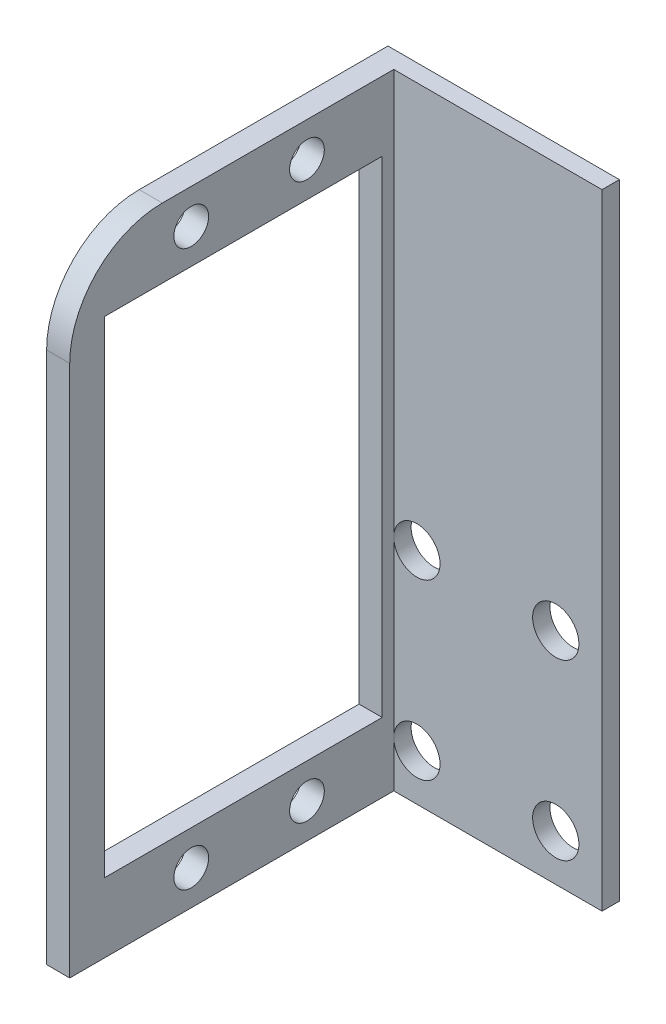
ISO-10303-21;
HEADER;
FILE_DESCRIPTION(('STEP AP214'),'2;1');
FILE_NAME('part.step','',(''),(''),'','','');
FILE_SCHEMA(('AUTOMOTIVE_DESIGN { 1 0 10303 214 1 1 1 1 }'));
ENDSEC;
DATA;
#1=APPLICATION_CONTEXT('core data for automotive mechanical design processes');
#2=APPLICATION_PROTOCOL_DEFINITION('international standard','automotive_design',2000,#1);
#3=PRODUCT_CONTEXT('',#1,'mechanical');
#4=PRODUCT('Part','Part','',(#3));
#5=PRODUCT_RELATED_PRODUCT_CATEGORY('part','',(#4));
#6=PRODUCT_DEFINITION_FORMATION('','',#4);
#7=PRODUCT_DEFINITION_CONTEXT('part definition',#1,'design');
#8=PRODUCT_DEFINITION('design','',#6,#7);
#9=PRODUCT_DEFINITION_SHAPE('','',#8);
#10=(LENGTH_UNIT() NAMED_UNIT(*) SI_UNIT(.MILLI.,.METRE.));
#11=(NAMED_UNIT(*) PLANE_ANGLE_UNIT() SI_UNIT($,.RADIAN.));
#12=(NAMED_UNIT(*) SI_UNIT($,.STERADIAN.) SOLID_ANGLE_UNIT());
#13=UNCERTAINTY_MEASURE_WITH_UNIT(LENGTH_MEASURE(1.E-05),#10,'distance_accuracy_value','');
#14=(GEOMETRIC_REPRESENTATION_CONTEXT(3) GLOBAL_UNCERTAINTY_ASSIGNED_CONTEXT((#13)) GLOBAL_UNIT_ASSIGNED_CONTEXT((#10,
#11,#12)) REPRESENTATION_CONTEXT('',''));
#15=CARTESIAN_POINT('',(0.,0.,0.));
#16=DIRECTION('',(0.,0.,1.));
#17=DIRECTION('',(1.,0.,0.));
#18=AXIS2_PLACEMENT_3D('',#15,#16,#17);
#19=CARTESIAN_POINT('',(2.,0.,0.));
#20=DIRECTION('',(1.,0.,0.));
#21=DIRECTION('',(0.,0.,-1.));
#22=AXIS2_PLACEMENT_3D('',#19,#20,#21);
#23=PLANE('',#22);
#24=CARTESIAN_POINT('',(2.,3.00000000000001,7.50000000000001));
#25=DIRECTION('',(1.,0.,0.));
#26=DIRECTION('',(0.,0.,1.));
#27=AXIS2_PLACEMENT_3D('',#24,#25,#26);
#28=CIRCLE('',#27,1.5);
#29=CARTESIAN_POINT('',(2.,3.00000000000001,9.00000000000001));
#30=VERTEX_POINT('',#29);
#31=EDGE_CURVE('E171',#30,#30,#28,.T.);
#32=ORIENTED_EDGE('',*,*,#31,.F.);
#33=EDGE_LOOP('',(#32));
#34=FACE_BOUND('',#33,.T.);
#35=CARTESIAN_POINT('',(2.,51.,7.50000000000001));
#36=DIRECTION('',(1.,0.,0.));
#37=DIRECTION('',(0.,0.,-1.));
#38=AXIS2_PLACEMENT_3D('',#35,#36,#37);
#39=CIRCLE('',#38,1.5);
#40=CARTESIAN_POINT('',(2.,51.,6.));
#41=VERTEX_POINT('',#40);
#42=EDGE_CURVE('E183',#41,#41,#39,.T.);
#43=ORIENTED_EDGE('',*,*,#42,.F.);
#44=EDGE_LOOP('',(#43));
#45=FACE_BOUND('',#44,.T.);
#46=DIRECTION('',(0.,0.,1.));
#47=VECTOR('',#46,1.);
#48=CARTESIAN_POINT('',(2.,54.,0.));
#49=LINE('',#48,#47);
#50=CARTESIAN_POINT('',(2.,54.,0.));
#51=VERTEX_POINT('',#50);
#52=CARTESIAN_POINT('',(2.,54.,20.));
#53=VERTEX_POINT('',#52);
#54=EDGE_CURVE('E221',#51,#53,#49,.T.);
#55=ORIENTED_EDGE('',*,*,#54,.T.);
#56=CARTESIAN_POINT('',(2.,46.,20.));
#57=DIRECTION('',(1.,0.,0.));
#58=DIRECTION('',(0.,0.,-1.));
#59=AXIS2_PLACEMENT_3D('',#56,#57,#58);
#60=CIRCLE('',#59,8.);
#61=CARTESIAN_POINT('',(2.,46.,28.));
#62=VERTEX_POINT('',#61);
#63=EDGE_CURVE('E11',#53,#62,#60,.T.);
#64=ORIENTED_EDGE('',*,*,#63,.T.);
#65=DIRECTION('',(0.,-1.,0.));
#66=VECTOR('',#65,1.);
#67=CARTESIAN_POINT('',(2.,0.,28.));
#68=LINE('',#67,#66);
#69=CARTESIAN_POINT('',(2.,0.,28.));
#70=VERTEX_POINT('',#69);
#71=EDGE_CURVE('E225',#62,#70,#68,.T.);
#72=ORIENTED_EDGE('',*,*,#71,.T.);
#73=DIRECTION('',(0.,0.,-1.));
#74=VECTOR('',#73,1.);
#75=CARTESIAN_POINT('',(2.,0.,0.));
#76=LINE('',#75,#74);
#77=CARTESIAN_POINT('',(2.,0.,0.));
#78=VERTEX_POINT('',#77);
#79=EDGE_CURVE('E227',#70,#78,#76,.T.);
#80=ORIENTED_EDGE('',*,*,#79,.T.);
#81=DIRECTION('',(0.,1.,0.));
#82=VECTOR('',#81,1.);
#83=CARTESIAN_POINT('',(2.,0.,0.));
#84=LINE('',#83,#82);
#85=CARTESIAN_POINT('',(1.99999999999999,4.,0.));
#86=VERTEX_POINT('',#85);
#87=EDGE_CURVE('E218',#78,#86,#84,.T.);
#88=ORIENTED_EDGE('',*,*,#87,.T.);
#89=CARTESIAN_POINT('',(1.99999999999999,19.,0.));
#90=VERTEX_POINT('',#89);
#91=EDGE_CURVE('E222',#86,#90,#84,.T.);
#92=ORIENTED_EDGE('',*,*,#91,.T.);
#93=EDGE_CURVE('E223',#90,#51,#84,.T.);
#94=ORIENTED_EDGE('',*,*,#93,.T.);
#95=EDGE_LOOP('',(#55,#64,#72,#80,#88,#92,#94));
#96=FACE_BOUND('',#95,.T.);
#97=DIRECTION('',(0.,0.,-1.));
#98=VECTOR('',#97,1.);
#99=CARTESIAN_POINT('',(2.,6.,25.));
#100=LINE('',#99,#98);
#101=CARTESIAN_POINT('',(2.,6.,25.));
#102=VERTEX_POINT('',#101);
#103=CARTESIAN_POINT('',(2.,6.,0.99999999999999));
#104=VERTEX_POINT('',#103);
#105=EDGE_CURVE('E191',#102,#104,#100,.T.);
#106=ORIENTED_EDGE('',*,*,#105,.F.);
#107=DIRECTION('',(0.,-1.,0.));
#108=VECTOR('',#107,1.);
#109=CARTESIAN_POINT('',(2.,48.,25.));
#110=LINE('',#109,#108);
#111=CARTESIAN_POINT('',(2.,48.,25.));
#112=VERTEX_POINT('',#111);
#113=EDGE_CURVE('E189',#112,#102,#110,.T.);
#114=ORIENTED_EDGE('',*,*,#113,.F.);
#115=DIRECTION('',(0.,0.,1.));
#116=VECTOR('',#115,1.);
#117=CARTESIAN_POINT('',(2.,48.,25.));
#118=LINE('',#117,#116);
#119=CARTESIAN_POINT('',(2.,48.,0.999999999999993));
#120=VERTEX_POINT('',#119);
#121=EDGE_CURVE('E197',#120,#112,#118,.T.);
#122=ORIENTED_EDGE('',*,*,#121,.F.);
#123=DIRECTION('',(0.,1.,0.));
#124=VECTOR('',#123,1.);
#125=CARTESIAN_POINT('',(2.,48.,0.999999999999993));
#126=LINE('',#125,#124);
#127=EDGE_CURVE('E194',#104,#120,#126,.T.);
#128=ORIENTED_EDGE('',*,*,#127,.F.);
#129=EDGE_LOOP('',(#106,#114,#122,#128));
#130=FACE_BOUND('',#129,.T.);
#131=CARTESIAN_POINT('',(2.,51.,17.5));
#132=DIRECTION('',(1.,0.,0.));
#133=DIRECTION('',(0.,0.,-1.));
#134=AXIS2_PLACEMENT_3D('',#131,#132,#133);
#135=CIRCLE('',#134,1.5);
#136=CARTESIAN_POINT('',(2.,51.,16.));
#137=VERTEX_POINT('',#136);
#138=EDGE_CURVE('E177',#137,#137,#135,.T.);
#139=ORIENTED_EDGE('',*,*,#138,.F.);
#140=EDGE_LOOP('',(#139));
#141=FACE_BOUND('',#140,.T.);
#142=CARTESIAN_POINT('',(2.,3.,17.5));
#143=DIRECTION('',(1.,0.,0.));
#144=DIRECTION('',(0.,0.,1.));
#145=AXIS2_PLACEMENT_3D('',#142,#143,#144);
#146=CIRCLE('',#145,1.49999999999999);
#147=CARTESIAN_POINT('',(2.,3.,19.));
#148=VERTEX_POINT('',#147);
#149=EDGE_CURVE('E165',#148,#148,#146,.T.);
#150=ORIENTED_EDGE('',*,*,#149,.F.);
#151=EDGE_LOOP('',(#150));
#152=FACE_BOUND('',#151,.T.);
#153=ADVANCED_FACE('F35',(#34,#45,#96,#130,#141,#152),#23,.T.);
#154=CARTESIAN_POINT('',(0.,0.,0.));
#155=DIRECTION('',(1.,0.,0.));
#156=DIRECTION('',(0.,0.,-1.));
#157=AXIS2_PLACEMENT_3D('',#154,#155,#156);
#158=PLANE('',#157);
#159=DIRECTION('',(0.,-1.,0.));
#160=VECTOR('',#159,1.);
#161=CARTESIAN_POINT('',(0.,0.,28.));
#162=LINE('',#161,#160);
#163=CARTESIAN_POINT('',(0.,46.,28.));
#164=VERTEX_POINT('',#163);
#165=CARTESIAN_POINT('',(0.,0.,28.));
#166=VERTEX_POINT('',#165);
#167=EDGE_CURVE('E128',#164,#166,#162,.T.);
#168=ORIENTED_EDGE('',*,*,#167,.F.);
#169=CARTESIAN_POINT('',(0.,46.,20.));
#170=DIRECTION('',(1.,0.,0.));
#171=DIRECTION('',(0.,0.,-1.));
#172=AXIS2_PLACEMENT_3D('',#169,#170,#171);
#173=CIRCLE('',#172,8.);
#174=CARTESIAN_POINT('',(0.,54.,20.));
#175=VERTEX_POINT('',#174);
#176=EDGE_CURVE('E57',#164,#175,#173,.F.);
#177=ORIENTED_EDGE('',*,*,#176,.T.);
#178=DIRECTION('',(0.,0.,1.));
#179=VECTOR('',#178,1.);
#180=CARTESIAN_POINT('',(0.,54.,0.));
#181=LINE('',#180,#179);
#182=CARTESIAN_POINT('',(0.,54.,-1.5));
#183=VERTEX_POINT('',#182);
#184=EDGE_CURVE('E121',#183,#175,#181,.T.);
#185=ORIENTED_EDGE('',*,*,#184,.F.);
#186=DIRECTION('',(0.,1.,0.));
#187=VECTOR('',#186,1.);
#188=CARTESIAN_POINT('',(0.,54.,-1.5));
#189=LINE('',#188,#187);
#190=CARTESIAN_POINT('',(0.,0.,-1.5));
#191=VERTEX_POINT('',#190);
#192=EDGE_CURVE('E127',#191,#183,#189,.T.);
#193=ORIENTED_EDGE('',*,*,#192,.F.);
#194=DIRECTION('',(0.,0.,-1.));
#195=VECTOR('',#194,1.);
#196=CARTESIAN_POINT('',(0.,0.,0.));
#197=LINE('',#196,#195);
#198=EDGE_CURVE('E232',#166,#191,#197,.T.);
#199=ORIENTED_EDGE('',*,*,#198,.F.);
#200=EDGE_LOOP('',(#168,#177,#185,#193,#199));
#201=FACE_BOUND('',#200,.T.);
#202=DIRECTION('',(0.,-1.,0.));
#203=VECTOR('',#202,1.);
#204=CARTESIAN_POINT('',(0.,48.,25.));
#205=LINE('',#204,#203);
#206=CARTESIAN_POINT('',(0.,48.,25.));
#207=VERTEX_POINT('',#206);
#208=CARTESIAN_POINT('',(0.,6.,25.));
#209=VERTEX_POINT('',#208);
#210=EDGE_CURVE('E186',#207,#209,#205,.T.);
#211=ORIENTED_EDGE('',*,*,#210,.T.);
#212=DIRECTION('',(0.,0.,-1.));
#213=VECTOR('',#212,1.);
#214=CARTESIAN_POINT('',(0.,6.,25.));
#215=LINE('',#214,#213);
#216=CARTESIAN_POINT('',(0.,6.,0.99999999999999));
#217=VERTEX_POINT('',#216);
#218=EDGE_CURVE('E202',#209,#217,#215,.T.);
#219=ORIENTED_EDGE('',*,*,#218,.T.);
#220=DIRECTION('',(0.,1.,0.));
#221=VECTOR('',#220,1.);
#222=CARTESIAN_POINT('',(0.,48.,0.999999999999993));
#223=LINE('',#222,#221);
#224=CARTESIAN_POINT('',(0.,48.,0.999999999999993));
#225=VERTEX_POINT('',#224);
#226=EDGE_CURVE('E205',#217,#225,#223,.T.);
#227=ORIENTED_EDGE('',*,*,#226,.T.);
#228=DIRECTION('',(0.,0.,1.));
#229=VECTOR('',#228,1.);
#230=CARTESIAN_POINT('',(0.,48.,25.));
#231=LINE('',#230,#229);
#232=EDGE_CURVE('E192',#225,#207,#231,.T.);
#233=ORIENTED_EDGE('',*,*,#232,.T.);
#234=EDGE_LOOP('',(#211,#219,#227,#233));
#235=FACE_BOUND('',#234,.T.);
#236=CARTESIAN_POINT('',(0.,51.,7.50000000000001));
#237=DIRECTION('',(1.,0.,0.));
#238=DIRECTION('',(0.,0.,-1.));
#239=AXIS2_PLACEMENT_3D('',#236,#237,#238);
#240=CIRCLE('',#239,1.5);
#241=CARTESIAN_POINT('',(0.,51.,6.));
#242=VERTEX_POINT('',#241);
#243=EDGE_CURVE('E180',#242,#242,#240,.T.);
#244=ORIENTED_EDGE('',*,*,#243,.T.);
#245=EDGE_LOOP('',(#244));
#246=FACE_BOUND('',#245,.T.);
#247=CARTESIAN_POINT('',(0.,51.,17.5));
#248=DIRECTION('',(1.,0.,0.));
#249=DIRECTION('',(0.,0.,-1.));
#250=AXIS2_PLACEMENT_3D('',#247,#248,#249);
#251=CIRCLE('',#250,1.5);
#252=CARTESIAN_POINT('',(0.,51.,16.));
#253=VERTEX_POINT('',#252);
#254=EDGE_CURVE('E174',#253,#253,#251,.T.);
#255=ORIENTED_EDGE('',*,*,#254,.T.);
#256=EDGE_LOOP('',(#255));
#257=FACE_BOUND('',#256,.T.);
#258=CARTESIAN_POINT('',(0.,3.00000000000001,7.50000000000001));
#259=DIRECTION('',(1.,0.,0.));
#260=DIRECTION('',(0.,0.,1.));
#261=AXIS2_PLACEMENT_3D('',#258,#259,#260);
#262=CIRCLE('',#261,1.5);
#263=CARTESIAN_POINT('',(0.,3.00000000000001,9.00000000000001));
#264=VERTEX_POINT('',#263);
#265=EDGE_CURVE('E168',#264,#264,#262,.T.);
#266=ORIENTED_EDGE('',*,*,#265,.T.);
#267=EDGE_LOOP('',(#266));
#268=FACE_BOUND('',#267,.T.);
#269=CARTESIAN_POINT('',(0.,3.,17.5));
#270=DIRECTION('',(1.,0.,0.));
#271=DIRECTION('',(0.,0.,1.));
#272=AXIS2_PLACEMENT_3D('',#269,#270,#271);
#273=CIRCLE('',#272,1.49999999999999);
#274=CARTESIAN_POINT('',(0.,3.,19.));
#275=VERTEX_POINT('',#274);
#276=EDGE_CURVE('E164',#275,#275,#273,.T.);
#277=ORIENTED_EDGE('',*,*,#276,.T.);
#278=EDGE_LOOP('',(#277));
#279=FACE_BOUND('',#278,.T.);
#280=ADVANCED_FACE('F123',(#201,#235,#246,#257,#268,#279),#158,.F.);
#281=CARTESIAN_POINT('',(2.,54.,0.));
#282=DIRECTION('',(0.,-1.,0.));
#283=DIRECTION('',(0.,0.,-1.));
#284=AXIS2_PLACEMENT_3D('',#281,#282,#283);
#285=PLANE('',#284);
#286=ORIENTED_EDGE('',*,*,#184,.T.);
#287=DIRECTION('',(-1.,0.,0.));
#288=VECTOR('',#287,1.);
#289=CARTESIAN_POINT('',(2.,54.,20.));
#290=LINE('',#289,#288);
#291=EDGE_CURVE('E43',#175,#53,#290,.F.);
#292=ORIENTED_EDGE('',*,*,#291,.T.);
#293=ORIENTED_EDGE('',*,*,#54,.F.);
#294=DIRECTION('',(1.,0.,0.));
#295=VECTOR('',#294,1.);
#296=CARTESIAN_POINT('',(0.,54.,0.));
#297=LINE('',#296,#295);
#298=CARTESIAN_POINT('',(20.,54.,0.));
#299=VERTEX_POINT('',#298);
#300=EDGE_CURVE('E157',#51,#299,#297,.T.);
#301=ORIENTED_EDGE('',*,*,#300,.T.);
#302=DIRECTION('',(0.,0.,1.));
#303=VECTOR('',#302,1.);
#304=CARTESIAN_POINT('',(20.,54.,-1.5));
#305=LINE('',#304,#303);
#306=CARTESIAN_POINT('',(20.,54.,-1.5));
#307=VERTEX_POINT('',#306);
#308=EDGE_CURVE('E135',#307,#299,#305,.T.);
#309=ORIENTED_EDGE('',*,*,#308,.F.);
#310=DIRECTION('',(1.,0.,0.));
#311=VECTOR('',#310,1.);
#312=CARTESIAN_POINT('',(0.,54.,-1.5));
#313=LINE('',#312,#311);
#314=EDGE_CURVE('E132',#183,#307,#313,.T.);
#315=ORIENTED_EDGE('',*,*,#314,.F.);
#316=EDGE_LOOP('',(#286,#292,#293,#301,#309,#315));
#317=FACE_BOUND('',#316,.T.);
#318=ADVANCED_FACE('F133',(#317),#285,.F.);
#319=CARTESIAN_POINT('',(2.,0.,28.));
#320=DIRECTION('',(0.,0.,-1.));
#321=DIRECTION('',(-1.,0.,0.));
#322=AXIS2_PLACEMENT_3D('',#319,#320,#321);
#323=PLANE('',#322);
#324=ORIENTED_EDGE('',*,*,#71,.F.);
#325=DIRECTION('',(-1.,0.,0.));
#326=VECTOR('',#325,1.);
#327=CARTESIAN_POINT('',(2.,46.,28.));
#328=LINE('',#327,#326);
#329=EDGE_CURVE('E236',#62,#164,#328,.T.);
#330=ORIENTED_EDGE('',*,*,#329,.T.);
#331=ORIENTED_EDGE('',*,*,#167,.T.);
#332=DIRECTION('',(-1.,0.,0.));
#333=VECTOR('',#332,1.);
#334=CARTESIAN_POINT('',(2.,0.,28.));
#335=LINE('',#334,#333);
#336=EDGE_CURVE('E229',#70,#166,#335,.T.);
#337=ORIENTED_EDGE('',*,*,#336,.F.);
#338=EDGE_LOOP('',(#324,#330,#331,#337));
#339=FACE_BOUND('',#338,.T.);
#340=ADVANCED_FACE('F242',(#339),#323,.F.);
#341=CARTESIAN_POINT('',(2.,0.,0.));
#342=DIRECTION('',(0.,1.,0.));
#343=DIRECTION('',(0.,0.,1.));
#344=AXIS2_PLACEMENT_3D('',#341,#342,#343);
#345=PLANE('',#344);
#346=ORIENTED_EDGE('',*,*,#198,.T.);
#347=DIRECTION('',(-1.,0.,0.));
#348=VECTOR('',#347,1.);
#349=CARTESIAN_POINT('',(0.,0.,-1.5));
#350=LINE('',#349,#348);
#351=CARTESIAN_POINT('',(20.,0.,-1.5));
#352=VERTEX_POINT('',#351);
#353=EDGE_CURVE('E144',#352,#191,#350,.T.);
#354=ORIENTED_EDGE('',*,*,#353,.F.);
#355=DIRECTION('',(0.,0.,1.));
#356=VECTOR('',#355,1.);
#357=CARTESIAN_POINT('',(20.,0.,-1.5));
#358=LINE('',#357,#356);
#359=CARTESIAN_POINT('',(20.,0.,0.));
#360=VERTEX_POINT('',#359);
#361=EDGE_CURVE('E156',#352,#360,#358,.T.);
#362=ORIENTED_EDGE('',*,*,#361,.T.);
#363=DIRECTION('',(-1.,0.,0.));
#364=VECTOR('',#363,1.);
#365=CARTESIAN_POINT('',(0.,0.,0.));
#366=LINE('',#365,#364);
#367=EDGE_CURVE('E145',#360,#78,#366,.T.);
#368=ORIENTED_EDGE('',*,*,#367,.T.);
#369=ORIENTED_EDGE('',*,*,#79,.F.);
#370=ORIENTED_EDGE('',*,*,#336,.T.);
#371=EDGE_LOOP('',(#346,#354,#362,#368,#369,#370));
#372=FACE_BOUND('',#371,.T.);
#373=ADVANCED_FACE('F247',(#372),#345,.F.);
#374=CARTESIAN_POINT('',(2.,48.,25.));
#375=DIRECTION('',(0.,0.,-1.));
#376=DIRECTION('',(0.,1.,0.));
#377=AXIS2_PLACEMENT_3D('',#374,#375,#376);
#378=PLANE('',#377);
#379=ORIENTED_EDGE('',*,*,#210,.F.);
#380=DIRECTION('',(-1.,0.,0.));
#381=VECTOR('',#380,1.);
#382=CARTESIAN_POINT('',(2.,48.,25.));
#383=LINE('',#382,#381);
#384=EDGE_CURVE('E199',#112,#207,#383,.T.);
#385=ORIENTED_EDGE('',*,*,#384,.F.);
#386=ORIENTED_EDGE('',*,*,#113,.T.);
#387=DIRECTION('',(-1.,0.,0.));
#388=VECTOR('',#387,1.);
#389=CARTESIAN_POINT('',(2.,6.,25.));
#390=LINE('',#389,#388);
#391=EDGE_CURVE('E129',#102,#209,#390,.T.);
#392=ORIENTED_EDGE('',*,*,#391,.T.);
#393=EDGE_LOOP('',(#379,#385,#386,#392));
#394=FACE_BOUND('',#393,.T.);
#395=ADVANCED_FACE('F273',(#394),#378,.T.);
#396=CARTESIAN_POINT('',(2.,6.,25.));
#397=DIRECTION('',(0.,1.,0.));
#398=DIRECTION('',(0.,0.,1.));
#399=AXIS2_PLACEMENT_3D('',#396,#397,#398);
#400=PLANE('',#399);
#401=ORIENTED_EDGE('',*,*,#218,.F.);
#402=ORIENTED_EDGE('',*,*,#391,.F.);
#403=ORIENTED_EDGE('',*,*,#105,.T.);
#404=DIRECTION('',(-1.,0.,0.));
#405=VECTOR('',#404,1.);
#406=CARTESIAN_POINT('',(2.,6.,0.99999999999999));
#407=LINE('',#406,#405);
#408=EDGE_CURVE('E214',#104,#217,#407,.T.);
#409=ORIENTED_EDGE('',*,*,#408,.T.);
#410=EDGE_LOOP('',(#401,#402,#403,#409));
#411=FACE_BOUND('',#410,.T.);
#412=ADVANCED_FACE('F423',(#411),#400,.T.);
#413=CARTESIAN_POINT('',(2.,48.,0.999999999999993));
#414=DIRECTION('',(0.,0.,1.));
#415=DIRECTION('',(0.,-1.,0.));
#416=AXIS2_PLACEMENT_3D('',#413,#414,#415);
#417=PLANE('',#416);
#418=ORIENTED_EDGE('',*,*,#226,.F.);
#419=ORIENTED_EDGE('',*,*,#408,.F.);
#420=ORIENTED_EDGE('',*,*,#127,.T.);
#421=DIRECTION('',(-1.,0.,0.));
#422=VECTOR('',#421,1.);
#423=CARTESIAN_POINT('',(2.,48.,0.999999999999993));
#424=LINE('',#423,#422);
#425=EDGE_CURVE('E212',#120,#225,#424,.T.);
#426=ORIENTED_EDGE('',*,*,#425,.T.);
#427=EDGE_LOOP('',(#418,#419,#420,#426));
#428=FACE_BOUND('',#427,.T.);
#429=ADVANCED_FACE('F414',(#428),#417,.T.);
#430=CARTESIAN_POINT('',(2.,48.,25.));
#431=DIRECTION('',(0.,-1.,0.));
#432=DIRECTION('',(0.,0.,-1.));
#433=AXIS2_PLACEMENT_3D('',#430,#431,#432);
#434=PLANE('',#433);
#435=ORIENTED_EDGE('',*,*,#232,.F.);
#436=ORIENTED_EDGE('',*,*,#425,.F.);
#437=ORIENTED_EDGE('',*,*,#121,.T.);
#438=ORIENTED_EDGE('',*,*,#384,.T.);
#439=EDGE_LOOP('',(#435,#436,#437,#438));
#440=FACE_BOUND('',#439,.T.);
#441=ADVANCED_FACE('F405',(#440),#434,.T.);
#442=CARTESIAN_POINT('',(2.,51.,7.50000000000001));
#443=DIRECTION('',(-1.,0.,0.));
#444=DIRECTION('',(0.,0.,1.));
#445=AXIS2_PLACEMENT_3D('',#442,#443,#444);
#446=CYLINDRICAL_SURFACE('',#445,1.5);
#447=ORIENTED_EDGE('',*,*,#42,.T.);
#448=EDGE_LOOP('',(#447));
#449=FACE_BOUND('',#448,.T.);
#450=ORIENTED_EDGE('',*,*,#243,.F.);
#451=EDGE_LOOP('',(#450));
#452=FACE_BOUND('',#451,.T.);
#453=ADVANCED_FACE('F396',(#449,#452),#446,.F.);
#454=CARTESIAN_POINT('',(2.,51.,17.5));
#455=DIRECTION('',(-1.,0.,0.));
#456=DIRECTION('',(0.,0.,1.));
#457=AXIS2_PLACEMENT_3D('',#454,#455,#456);
#458=CYLINDRICAL_SURFACE('',#457,1.5);
#459=ORIENTED_EDGE('',*,*,#138,.T.);
#460=EDGE_LOOP('',(#459));
#461=FACE_BOUND('',#460,.T.);
#462=ORIENTED_EDGE('',*,*,#254,.F.);
#463=EDGE_LOOP('',(#462));
#464=FACE_BOUND('',#463,.T.);
#465=ADVANCED_FACE('F387',(#461,#464),#458,.F.);
#466=CARTESIAN_POINT('',(2.,3.00000000000001,7.50000000000001));
#467=DIRECTION('',(-1.,0.,0.));
#468=DIRECTION('',(0.,0.,1.));
#469=AXIS2_PLACEMENT_3D('',#466,#467,#468);
#470=CYLINDRICAL_SURFACE('',#469,1.5);
#471=ORIENTED_EDGE('',*,*,#31,.T.);
#472=EDGE_LOOP('',(#471));
#473=FACE_BOUND('',#472,.T.);
#474=ORIENTED_EDGE('',*,*,#265,.F.);
#475=EDGE_LOOP('',(#474));
#476=FACE_BOUND('',#475,.T.);
#477=ADVANCED_FACE('F378',(#473,#476),#470,.F.);
#478=CARTESIAN_POINT('',(2.,3.,17.5));
#479=DIRECTION('',(-1.,0.,0.));
#480=DIRECTION('',(0.,0.,1.));
#481=AXIS2_PLACEMENT_3D('',#478,#479,#480);
#482=CYLINDRICAL_SURFACE('',#481,1.49999999999999);
#483=ORIENTED_EDGE('',*,*,#149,.T.);
#484=EDGE_LOOP('',(#483));
#485=FACE_BOUND('',#484,.T.);
#486=ORIENTED_EDGE('',*,*,#276,.F.);
#487=EDGE_LOOP('',(#486));
#488=FACE_BOUND('',#487,.T.);
#489=ADVANCED_FACE('F347',(#485,#488),#482,.F.);
#490=CARTESIAN_POINT('',(0.,0.,0.));
#491=DIRECTION('',(0.,0.,1.));
#492=DIRECTION('',(0.,-1.,0.));
#493=AXIS2_PLACEMENT_3D('',#490,#491,#492);
#494=PLANE('',#493);
#495=CARTESIAN_POINT('',(16.,19.,0.));
#496=DIRECTION('',(0.,0.,-1.));
#497=DIRECTION('',(0.,-1.,0.));
#498=AXIS2_PLACEMENT_3D('',#495,#496,#497);
#499=CIRCLE('',#498,2.);
#500=CARTESIAN_POINT('',(16.,17.,0.));
#501=VERTEX_POINT('',#500);
#502=EDGE_CURVE('E489',#501,#501,#499,.T.);
#503=ORIENTED_EDGE('',*,*,#502,.T.);
#504=EDGE_LOOP('',(#503));
#505=FACE_BOUND('',#504,.T.);
#506=CARTESIAN_POINT('',(16.,4.,0.));
#507=DIRECTION('',(0.,0.,-1.));
#508=DIRECTION('',(0.,1.,0.));
#509=AXIS2_PLACEMENT_3D('',#506,#507,#508);
#510=CIRCLE('',#509,2.);
#511=CARTESIAN_POINT('',(16.,6.,0.));
#512=VERTEX_POINT('',#511);
#513=EDGE_CURVE('E151',#512,#512,#510,.T.);
#514=ORIENTED_EDGE('',*,*,#513,.T.);
#515=EDGE_LOOP('',(#514));
#516=FACE_BOUND('',#515,.T.);
#517=ORIENTED_EDGE('',*,*,#87,.F.);
#518=ORIENTED_EDGE('',*,*,#367,.F.);
#519=DIRECTION('',(0.,-1.,0.));
#520=VECTOR('',#519,1.);
#521=CARTESIAN_POINT('',(20.,54.,0.));
#522=LINE('',#521,#520);
#523=EDGE_CURVE('E148',#299,#360,#522,.T.);
#524=ORIENTED_EDGE('',*,*,#523,.F.);
#525=ORIENTED_EDGE('',*,*,#300,.F.);
#526=ORIENTED_EDGE('',*,*,#93,.F.);
#527=CARTESIAN_POINT('',(3.99999999999999,19.,0.));
#528=DIRECTION('',(0.,0.,-1.));
#529=DIRECTION('',(0.,-1.,0.));
#530=AXIS2_PLACEMENT_3D('',#527,#528,#529);
#531=CIRCLE('',#530,2.);
#532=EDGE_CURVE('E505',#90,#90,#531,.T.);
#533=ORIENTED_EDGE('',*,*,#532,.T.);
#534=ORIENTED_EDGE('',*,*,#91,.F.);
#535=CARTESIAN_POINT('',(3.99999999999999,4.,0.));
#536=DIRECTION('',(0.,0.,-1.));
#537=DIRECTION('',(0.,1.,0.));
#538=AXIS2_PLACEMENT_3D('',#535,#536,#537);
#539=CIRCLE('',#538,2.);
#540=EDGE_CURVE('E496',#86,#86,#539,.T.);
#541=ORIENTED_EDGE('',*,*,#540,.T.);
#542=EDGE_LOOP('',(#517,#518,#524,#525,#526,#533,#534,#541));
#543=FACE_BOUND('',#542,.T.);
#544=ADVANCED_FACE('F339',(#505,#516,#543),#494,.T.);
#545=CARTESIAN_POINT('',(0.,0.,-1.5));
#546=DIRECTION('',(0.,0.,1.));
#547=DIRECTION('',(0.,-1.,0.));
#548=AXIS2_PLACEMENT_3D('',#545,#546,#547);
#549=PLANE('',#548);
#550=ORIENTED_EDGE('',*,*,#192,.T.);
#551=ORIENTED_EDGE('',*,*,#314,.T.);
#552=DIRECTION('',(0.,-1.,0.));
#553=VECTOR('',#552,1.);
#554=CARTESIAN_POINT('',(20.,54.,-1.5));
#555=LINE('',#554,#553);
#556=EDGE_CURVE('E138',#307,#352,#555,.T.);
#557=ORIENTED_EDGE('',*,*,#556,.T.);
#558=ORIENTED_EDGE('',*,*,#353,.T.);
#559=EDGE_LOOP('',(#550,#551,#557,#558));
#560=FACE_BOUND('',#559,.T.);
#561=CARTESIAN_POINT('',(16.,4.,-1.5));
#562=DIRECTION('',(0.,0.,-1.));
#563=DIRECTION('',(0.,1.,0.));
#564=AXIS2_PLACEMENT_3D('',#561,#562,#563);
#565=CIRCLE('',#564,2.);
#566=CARTESIAN_POINT('',(16.,6.,-1.5));
#567=VERTEX_POINT('',#566);
#568=EDGE_CURVE('E159',#567,#567,#565,.T.);
#569=ORIENTED_EDGE('',*,*,#568,.F.);
#570=EDGE_LOOP('',(#569));
#571=FACE_BOUND('',#570,.T.);
#572=CARTESIAN_POINT('',(3.99999999999999,4.,-1.5));
#573=DIRECTION('',(0.,0.,-1.));
#574=DIRECTION('',(0.,1.,0.));
#575=AXIS2_PLACEMENT_3D('',#572,#573,#574);
#576=CIRCLE('',#575,2.);
#577=CARTESIAN_POINT('',(3.99999999999999,6.,-1.5));
#578=VERTEX_POINT('',#577);
#579=EDGE_CURVE('E499',#578,#578,#576,.T.);
#580=ORIENTED_EDGE('',*,*,#579,.F.);
#581=EDGE_LOOP('',(#580));
#582=FACE_BOUND('',#581,.T.);
#583=CARTESIAN_POINT('',(3.99999999999999,19.,-1.5));
#584=DIRECTION('',(0.,0.,-1.));
#585=DIRECTION('',(0.,-1.,0.));
#586=AXIS2_PLACEMENT_3D('',#583,#584,#585);
#587=CIRCLE('',#586,2.);
#588=CARTESIAN_POINT('',(3.99999999999999,17.,-1.5));
#589=VERTEX_POINT('',#588);
#590=EDGE_CURVE('E500',#589,#589,#587,.T.);
#591=ORIENTED_EDGE('',*,*,#590,.F.);
#592=EDGE_LOOP('',(#591));
#593=FACE_BOUND('',#592,.T.);
#594=CARTESIAN_POINT('',(16.,19.,-1.5));
#595=DIRECTION('',(0.,0.,-1.));
#596=DIRECTION('',(0.,-1.,0.));
#597=AXIS2_PLACEMENT_3D('',#594,#595,#596);
#598=CIRCLE('',#597,2.);
#599=CARTESIAN_POINT('',(16.,17.,-1.5));
#600=VERTEX_POINT('',#599);
#601=EDGE_CURVE('E518',#600,#600,#598,.T.);
#602=ORIENTED_EDGE('',*,*,#601,.F.);
#603=EDGE_LOOP('',(#602));
#604=FACE_BOUND('',#603,.T.);
#605=ADVANCED_FACE('F141',(#560,#571,#582,#593,#604),#549,.F.);
#606=CARTESIAN_POINT('',(20.,54.,-1.5));
#607=DIRECTION('',(-1.,0.,0.));
#608=DIRECTION('',(0.,-1.,0.));
#609=AXIS2_PLACEMENT_3D('',#606,#607,#608);
#610=PLANE('',#609);
#611=ORIENTED_EDGE('',*,*,#523,.T.);
#612=ORIENTED_EDGE('',*,*,#361,.F.);
#613=ORIENTED_EDGE('',*,*,#556,.F.);
#614=ORIENTED_EDGE('',*,*,#308,.T.);
#615=EDGE_LOOP('',(#611,#612,#613,#614));
#616=FACE_BOUND('',#615,.T.);
#617=ADVANCED_FACE('F322',(#616),#610,.F.);
#618=CARTESIAN_POINT('',(16.,4.,-1.5));
#619=DIRECTION('',(0.,0.,1.));
#620=DIRECTION('',(0.,-1.,0.));
#621=AXIS2_PLACEMENT_3D('',#618,#619,#620);
#622=CYLINDRICAL_SURFACE('',#621,2.);
#623=ORIENTED_EDGE('',*,*,#568,.T.);
#624=EDGE_LOOP('',(#623));
#625=FACE_BOUND('',#624,.T.);
#626=ORIENTED_EDGE('',*,*,#513,.F.);
#627=EDGE_LOOP('',(#626));
#628=FACE_BOUND('',#627,.T.);
#629=ADVANCED_FACE('F313',(#625,#628),#622,.F.);
#630=CARTESIAN_POINT('',(3.99999999999999,4.,-1.5));
#631=DIRECTION('',(0.,0.,1.));
#632=DIRECTION('',(0.,-1.,0.));
#633=AXIS2_PLACEMENT_3D('',#630,#631,#632);
#634=CYLINDRICAL_SURFACE('',#633,2.);
#635=ORIENTED_EDGE('',*,*,#579,.T.);
#636=EDGE_LOOP('',(#635));
#637=FACE_BOUND('',#636,.T.);
#638=ORIENTED_EDGE('',*,*,#540,.F.);
#639=EDGE_LOOP('',(#638));
#640=FACE_BOUND('',#639,.T.);
#641=ADVANCED_FACE('F304',(#637,#640),#634,.F.);
#642=CARTESIAN_POINT('',(3.99999999999999,19.,-1.5));
#643=DIRECTION('',(0.,0.,1.));
#644=DIRECTION('',(0.,-1.,0.));
#645=AXIS2_PLACEMENT_3D('',#642,#643,#644);
#646=CYLINDRICAL_SURFACE('',#645,2.);
#647=ORIENTED_EDGE('',*,*,#590,.T.);
#648=EDGE_LOOP('',(#647));
#649=FACE_BOUND('',#648,.T.);
#650=ORIENTED_EDGE('',*,*,#532,.F.);
#651=EDGE_LOOP('',(#650));
#652=FACE_BOUND('',#651,.T.);
#653=ADVANCED_FACE('F259',(#649,#652),#646,.F.);
#654=CARTESIAN_POINT('',(16.,19.,-1.5));
#655=DIRECTION('',(0.,0.,1.));
#656=DIRECTION('',(0.,-1.,0.));
#657=AXIS2_PLACEMENT_3D('',#654,#655,#656);
#658=CYLINDRICAL_SURFACE('',#657,2.);
#659=ORIENTED_EDGE('',*,*,#601,.T.);
#660=EDGE_LOOP('',(#659));
#661=FACE_BOUND('',#660,.T.);
#662=ORIENTED_EDGE('',*,*,#502,.F.);
#663=EDGE_LOOP('',(#662));
#664=FACE_BOUND('',#663,.T.);
#665=ADVANCED_FACE('F255',(#661,#664),#658,.F.);
#666=CARTESIAN_POINT('',(2.,46.,20.));
#667=DIRECTION('',(-1.,0.,0.));
#668=DIRECTION('',(0.,0.,1.));
#669=AXIS2_PLACEMENT_3D('',#666,#667,#668);
#670=CYLINDRICAL_SURFACE('',#669,8.);
#671=ORIENTED_EDGE('',*,*,#63,.F.);
#672=ORIENTED_EDGE('',*,*,#291,.F.);
#673=ORIENTED_EDGE('',*,*,#176,.F.);
#674=ORIENTED_EDGE('',*,*,#329,.F.);
#675=EDGE_LOOP('',(#671,#672,#673,#674));
#676=FACE_BOUND('',#675,.T.);
#677=ADVANCED_FACE('F37',(#676),#670,.T.);
#678=CLOSED_SHELL('',(#153,#280,#318,#340,#373,#395,#412,#429,#441,#453,#465,#477,#489,#544,
#605,#617,#629,#641,#653,#665,#677));
#679=MANIFOLD_SOLID_BREP('B2',#678);
#680=ADVANCED_BREP_SHAPE_REPRESENTATION('',(#18,#679),#14);
#681=SHAPE_DEFINITION_REPRESENTATION(#9,#680);
ENDSEC;
END-ISO-10303-21;
